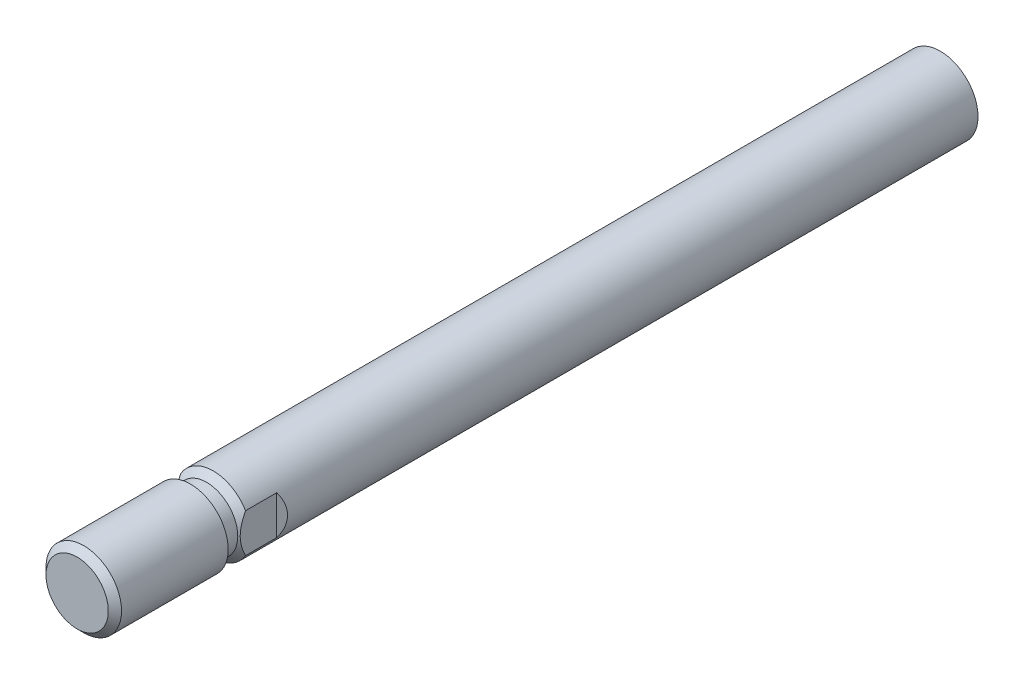
ISO-10303-21;
HEADER;
FILE_DESCRIPTION(('STEP AP214'),'2;1');
FILE_NAME('part.step','',(''),(''),'','','');
FILE_SCHEMA(('AUTOMOTIVE_DESIGN { 1 0 10303 214 1 1 1 1 }'));
ENDSEC;
DATA;
#1=APPLICATION_CONTEXT('core data for automotive mechanical design processes');
#2=APPLICATION_PROTOCOL_DEFINITION('international standard','automotive_design',2000,#1);
#3=PRODUCT_CONTEXT('',#1,'mechanical');
#4=PRODUCT('Part','Part','',(#3));
#5=PRODUCT_RELATED_PRODUCT_CATEGORY('part','',(#4));
#6=PRODUCT_DEFINITION_FORMATION('','',#4);
#7=PRODUCT_DEFINITION_CONTEXT('part definition',#1,'design');
#8=PRODUCT_DEFINITION('design','',#6,#7);
#9=PRODUCT_DEFINITION_SHAPE('','',#8);
#10=(LENGTH_UNIT() NAMED_UNIT(*) SI_UNIT(.MILLI.,.METRE.));
#11=(NAMED_UNIT(*) PLANE_ANGLE_UNIT() SI_UNIT($,.RADIAN.));
#12=(NAMED_UNIT(*) SI_UNIT($,.STERADIAN.) SOLID_ANGLE_UNIT());
#13=UNCERTAINTY_MEASURE_WITH_UNIT(LENGTH_MEASURE(1.E-05),#10,'distance_accuracy_value','');
#14=(GEOMETRIC_REPRESENTATION_CONTEXT(3) GLOBAL_UNCERTAINTY_ASSIGNED_CONTEXT((#13)) GLOBAL_UNIT_ASSIGNED_CONTEXT((#10,
#11,#12)) REPRESENTATION_CONTEXT('',''));
#15=CARTESIAN_POINT('',(0.,0.,0.));
#16=DIRECTION('',(0.,0.,1.));
#17=DIRECTION('',(1.,0.,0.));
#18=AXIS2_PLACEMENT_3D('',#15,#16,#17);
#19=CARTESIAN_POINT('',(-6.,3.60555127546399,2.99999999999909));
#20=CARTESIAN_POINT('',(-7.,3.60555127546399,1.99999999999999));
#21=CARTESIAN_POINT('',(-7.01,3.60555127546399,1.99));
#22=CARTESIAN_POINT('',(-7.04742844491216,3.60555127546399,1.95257155508788));
#23=B_SPLINE_CURVE_WITH_KNOTS('',1,(#19,#20,#21,#22),.UNSPECIFIED.,.F.,.F.,(2,1,1,2),(0.,1.,
1.01,1.04742844491216),.UNSPECIFIED.);
#24=DIRECTION('',(0.,-1.,0.));
#25=VECTOR('',#24,1.);
#26=SURFACE_OF_LINEAR_EXTRUSION('',#23,#25);
#27=CARTESIAN_POINT('',(-6.,-3.60555127546399,2.99999999999909));
#28=CARTESIAN_POINT('',(-6.05460305009511,-3.5146872681726,2.94539694990403));
#29=CARTESIAN_POINT('',(-6.10757727467276,-3.42185611468313,2.89242272532643));
#30=CARTESIAN_POINT('',(-6.20995893059434,-3.23233818919024,2.79004106940494));
#31=CARTESIAN_POINT('',(-6.25936623712517,-3.13565128245044,2.74063376287415));
#32=CARTESIAN_POINT('',(-6.3715105468397,-2.90276915492651,2.62848945315972));
#33=CARTESIAN_POINT('',(-6.43258592312827,-2.76495908411827,2.56741407687121));
#34=CARTESIAN_POINT('',(-6.54672958419891,-2.48264694016197,2.45327041580067));
#35=CARTESIAN_POINT('',(-6.59978928841199,-2.33813790912282,2.40021071158764));
#36=CARTESIAN_POINT('',(-6.69392147324922,-2.05245990341542,2.30607852675049));
#37=CARTESIAN_POINT('',(-6.73553694117638,-1.91164956276678,2.26446305882338));
#38=CARTESIAN_POINT('',(-6.81025329105877,-1.62551978340571,2.18974670894105));
#39=CARTESIAN_POINT('',(-6.84335189266993,-1.48019914873369,2.15664810732992));
#40=CARTESIAN_POINT('',(-6.90043231877212,-1.18595830748508,2.09956768122778));
#41=CARTESIAN_POINT('',(-6.92441131711201,-1.03703700024732,2.07558868288792));
#42=CARTESIAN_POINT('',(-6.96276594802224,-0.736746416045404,2.03723405197771));
#43=CARTESIAN_POINT('',(-6.97714263694242,-0.585377410229584,2.02285736305755));
#44=CARTESIAN_POINT('',(-6.99572154368489,-0.28587830644124,2.0042784563151));
#45=CARTESIAN_POINT('',(-7.00021035163798,-0.13778375353011,1.99978964836201));
#46=CARTESIAN_POINT('',(-6.99977449836706,0.158379860346094,2.00022550163293));
#47=CARTESIAN_POINT('',(-6.99484978126693,0.306448921154636,2.00515021873306));
#48=CARTESIAN_POINT('',(-6.975687614797,0.601342282417001,2.02431238520297));
#49=CARTESIAN_POINT('',(-6.96145196395231,0.748166817719649,2.03854803604764));
#50=CARTESIAN_POINT('',(-6.92394773734483,1.03947831910818,2.07605226265509));
#51=CARTESIAN_POINT('',(-6.9006794379425,1.18396535657063,2.0993205620574));
#52=CARTESIAN_POINT('',(-6.84694084650818,1.46235102562406,2.15305915349167));
#53=CARTESIAN_POINT('',(-6.81689596661697,1.59641489106689,2.18310403338285));
#54=CARTESIAN_POINT('',(-6.74950326023188,1.86086901707836,2.25049673976788));
#55=CARTESIAN_POINT('',(-6.71215258210059,1.99125782036754,2.28784741789914));
#56=CARTESIAN_POINT('',(-6.63067311834595,2.24772818276417,2.36932688165371));
#57=CARTESIAN_POINT('',(-6.58654375451224,2.37380937331705,2.41345624548738));
#58=CARTESIAN_POINT('',(-6.4920526650485,2.6212197252559,2.50794733495103));
#59=CARTESIAN_POINT('',(-6.44169006144759,2.74254821403355,2.5583099385519));
#60=CARTESIAN_POINT('',(-6.33000802367995,2.99189983642159,2.66999197631944));
#61=CARTESIAN_POINT('',(-6.268097211647,3.11939203472726,2.73190278835233));
#62=CARTESIAN_POINT('',(-6.13834506086701,3.36753252598152,2.86165493913221));
#63=CARTESIAN_POINT('',(-6.07052450866687,3.48820252690629,2.92947549133228));
#64=CARTESIAN_POINT('',(-6.,3.60555127546399,2.99999999999909));
#65=B_SPLINE_CURVE_WITH_KNOTS('',3,(#27,#28,#29,#30,#31,#32,#33,#34,#35,#36,#37,#38,#39,#40,#41,
#42,#43,#44,#45,#46,#47,#48,#49,#50,#51,#52,#53,#54,#55,#56,#57,#58,#59,#60,#61,#62,#63,#64),
.UNSPECIFIED.,.F.,.F.,(4,2,2,2,2,2,2,2,2,2,2,2,2,2,2,2,2,2,4),(0.,0.357700752589725,
0.715414015733441,1.20281762818256,1.69073935171607,2.14807007841627,2.60552312579027,
3.06311782187332,3.52066216967974,3.96476024014663,4.40886094666717,4.85287589482044,
5.29687725908359,5.71834638720044,6.13998035482457,6.56165030710014,6.98337972061568,
7.44697123336742,7.90899331902848),.UNSPECIFIED.);
#66=CARTESIAN_POINT('',(-6.,-3.60555127546399,2.99999999999909));
#67=VERTEX_POINT('',#66);
#68=CARTESIAN_POINT('',(-6.,3.60555127546399,2.99999999999909));
#69=VERTEX_POINT('',#68);
#70=EDGE_CURVE('E21',#67,#69,#65,.T.);
#71=ORIENTED_EDGE('',*,*,#70,.F.);
#72=DIRECTION('',(0.,-1.,0.));
#73=VECTOR('',#72,1.);
#74=CARTESIAN_POINT('',(-6.,3.60555127546399,2.99999999999909));
#75=LINE('',#74,#73);
#76=EDGE_CURVE('E62',#69,#67,#75,.T.);
#77=ORIENTED_EDGE('',*,*,#76,.F.);
#78=EDGE_LOOP('',(#71,#77));
#79=FACE_BOUND('',#78,.T.);
#80=ADVANCED_FACE('F16',(#79),#26,.T.);
#81=CARTESIAN_POINT('',(7.04742844491215,3.60555127546399,1.95257155508788));
#82=CARTESIAN_POINT('',(7.01,3.60555127546399,1.99));
#83=CARTESIAN_POINT('',(7.,3.60555127546399,1.99999999999999));
#84=CARTESIAN_POINT('',(6.,3.60555127546399,2.99999999999909));
#85=B_SPLINE_CURVE_WITH_KNOTS('',1,(#81,#82,#83,#84),.UNSPECIFIED.,.F.,.F.,(2,1,1,2),
(-0.0474284449121554,-0.01,0.,1.),.UNSPECIFIED.);
#86=DIRECTION('',(0.,-1.,0.));
#87=VECTOR('',#86,1.);
#88=SURFACE_OF_LINEAR_EXTRUSION('',#85,#87);
#89=CARTESIAN_POINT('',(6.,3.60555127546399,2.99999999999909));
#90=CARTESIAN_POINT('',(6.05460305009511,3.5146872681726,2.94539694990403));
#91=CARTESIAN_POINT('',(6.10757727467276,3.42185611468313,2.89242272532643));
#92=CARTESIAN_POINT('',(6.20995893059434,3.23233818919024,2.79004106940494));
#93=CARTESIAN_POINT('',(6.25936623712517,3.13565128245044,2.74063376287415));
#94=CARTESIAN_POINT('',(6.3715105468397,2.90276915492651,2.62848945315972));
#95=CARTESIAN_POINT('',(6.43258592312827,2.76495908411827,2.56741407687121));
#96=CARTESIAN_POINT('',(6.54672958419891,2.48264694016197,2.45327041580067));
#97=CARTESIAN_POINT('',(6.599789288412,2.33813790912282,2.40021071158763));
#98=CARTESIAN_POINT('',(6.69392147324923,2.05245990341542,2.30607852675049));
#99=CARTESIAN_POINT('',(6.73553694117638,1.91164956276678,2.26446305882338));
#100=CARTESIAN_POINT('',(6.81025329105877,1.62551978340571,2.18974670894105));
#101=CARTESIAN_POINT('',(6.84335189266993,1.48019914873369,2.15664810732992));
#102=CARTESIAN_POINT('',(6.90043231877212,1.18595830748507,2.09956768122778));
#103=CARTESIAN_POINT('',(6.92441131711201,1.03703700024732,2.07558868288792));
#104=CARTESIAN_POINT('',(6.96276594802224,0.7367464160454,2.03723405197771));
#105=CARTESIAN_POINT('',(6.97714263694242,0.58537741022958,2.02285736305755));
#106=CARTESIAN_POINT('',(6.99572154368489,0.285878306441236,2.0042784563151));
#107=CARTESIAN_POINT('',(7.00021035163798,0.137783753530106,1.99978964836201));
#108=CARTESIAN_POINT('',(6.99977449836706,-0.158379860346098,2.00022550163293));
#109=CARTESIAN_POINT('',(6.99484978126693,-0.30644892115464,2.00515021873306));
#110=CARTESIAN_POINT('',(6.975687614797,-0.601342282417005,2.02431238520297));
#111=CARTESIAN_POINT('',(6.96145196395231,-0.748166817719653,2.03854803604764));
#112=CARTESIAN_POINT('',(6.92394773734483,-1.03947831910818,2.07605226265509));
#113=CARTESIAN_POINT('',(6.9006794379425,-1.18396535657063,2.0993205620574));
#114=CARTESIAN_POINT('',(6.84694084650818,-1.46235102562406,2.15305915349167));
#115=CARTESIAN_POINT('',(6.81689596661697,-1.5964148910669,2.18310403338285));
#116=CARTESIAN_POINT('',(6.74950326023188,-1.86086901707836,2.25049673976789));
#117=CARTESIAN_POINT('',(6.71215258210059,-1.99125782036755,2.28784741789914));
#118=CARTESIAN_POINT('',(6.63067311834595,-2.24772818276417,2.36932688165371));
#119=CARTESIAN_POINT('',(6.58654375451224,-2.37380937331705,2.41345624548738));
#120=CARTESIAN_POINT('',(6.4920526650485,-2.6212197252559,2.50794733495103));
#121=CARTESIAN_POINT('',(6.44169006144758,-2.74254821403356,2.5583099385519));
#122=CARTESIAN_POINT('',(6.33000802367994,-2.99189983642159,2.66999197631944));
#123=CARTESIAN_POINT('',(6.268097211647,-3.11939203472726,2.73190278835233));
#124=CARTESIAN_POINT('',(6.13834506086701,-3.36753252598152,2.86165493913221));
#125=CARTESIAN_POINT('',(6.07052450866687,-3.48820252690629,2.92947549133228));
#126=CARTESIAN_POINT('',(6.,-3.60555127546399,2.99999999999909));
#127=B_SPLINE_CURVE_WITH_KNOTS('',3,(#89,#90,#91,#92,#93,#94,#95,#96,#97,#98,#99,#100,#101,#102,
#103,#104,#105,#106,#107,#108,#109,#110,#111,#112,#113,#114,#115,#116,#117,#118,#119,#120,#121,
#122,#123,#124,#125,#126),.UNSPECIFIED.,.F.,.F.,(4,2,2,2,2,2,2,2,2,2,2,2,2,2,2,2,2,2,4),(0.,
0.357700752589725,0.715414015733441,1.20281762818256,1.69073935171607,2.14807007841627,
2.60552312579027,3.06311782187332,3.52066216967974,3.96476024014664,4.40886094666717,
4.85287589482045,5.29687725908359,5.71834638720044,6.13998035482457,6.56165030710015,
6.98337972061568,7.44697123336742,7.90899331902848),.UNSPECIFIED.);
#128=CARTESIAN_POINT('',(6.,3.60555127546399,2.99999999999909));
#129=VERTEX_POINT('',#128);
#130=CARTESIAN_POINT('',(6.,-3.60555127546399,2.99999999999909));
#131=VERTEX_POINT('',#130);
#132=EDGE_CURVE('E99',#129,#131,#127,.T.);
#133=ORIENTED_EDGE('',*,*,#132,.F.);
#134=DIRECTION('',(0.,-1.,0.));
#135=VECTOR('',#134,1.);
#136=CARTESIAN_POINT('',(6.,3.60555127546399,2.99999999999909));
#137=LINE('',#136,#135);
#138=EDGE_CURVE('E76',#131,#129,#137,.F.);
#139=ORIENTED_EDGE('',*,*,#138,.F.);
#140=EDGE_LOOP('',(#133,#139));
#141=FACE_BOUND('',#140,.T.);
#142=ADVANCED_FACE('F92',(#141),#88,.T.);
#143=CARTESIAN_POINT('',(7.08400210827179,7.,-126.));
#144=DIRECTION('',(0.,0.,-1.));
#145=DIRECTION('',(0.,-1.,0.));
#146=AXIS2_PLACEMENT_3D('',#143,#144,#145);
#147=PLANE('',#146);
#148=CARTESIAN_POINT('',(0.,0.,-126.));
#149=DIRECTION('',(0.,0.,1.));
#150=DIRECTION('',(1.,0.,0.));
#151=AXIS2_PLACEMENT_3D('',#148,#149,#150);
#152=CIRCLE('',#151,7.);
#153=CARTESIAN_POINT('',(7.,0.,-126.));
#154=VERTEX_POINT('',#153);
#155=EDGE_CURVE('E106',#154,#154,#152,.T.);
#156=ORIENTED_EDGE('',*,*,#155,.F.);
#157=EDGE_LOOP('',(#156));
#158=FACE_BOUND('',#157,.T.);
#159=ADVANCED_FACE('F96',(#158),#147,.T.);
#160=CARTESIAN_POINT('',(-6.,3.60555127546399,9.81568678505333));
#161=DIRECTION('',(-1.,0.,0.));
#162=DIRECTION('',(0.,0.,-1.));
#163=AXIS2_PLACEMENT_3D('',#160,#161,#162);
#164=PLANE('',#163);
#165=DIRECTION('',(0.,0.,1.));
#166=VECTOR('',#165,1.);
#167=CARTESIAN_POINT('',(-6.,3.60555127546399,-58.6125000000002));
#168=LINE('',#167,#166);
#169=CARTESIAN_POINT('',(-6.,3.60555127546399,8.77499999999963));
#170=VERTEX_POINT('',#169);
#171=EDGE_CURVE('E71',#69,#170,#168,.T.);
#172=ORIENTED_EDGE('',*,*,#171,.F.);
#173=ORIENTED_EDGE('',*,*,#76,.T.);
#174=DIRECTION('',(0.,0.,-1.));
#175=VECTOR('',#174,1.);
#176=CARTESIAN_POINT('',(-6.,-3.60555127546399,-58.6125000000002));
#177=LINE('',#176,#175);
#178=CARTESIAN_POINT('',(-6.,-3.60555127546399,8.77499999999963));
#179=VERTEX_POINT('',#178);
#180=EDGE_CURVE('E67',#179,#67,#177,.T.);
#181=ORIENTED_EDGE('',*,*,#180,.F.);
#182=CARTESIAN_POINT('',(-6.,3.60555127546399,8.77499999999963));
#183=CARTESIAN_POINT('',(-6.,3.48201104346615,8.83862239786504));
#184=CARTESIAN_POINT('',(-6.,3.35749993655022,8.90036427200932));
#185=CARTESIAN_POINT('',(-6.,3.10632304907584,9.01948504833319));
#186=CARTESIAN_POINT('',(-6.,2.97965605501221,9.07686138668632));
#187=CARTESIAN_POINT('',(-6.,2.59475646017048,9.24210047370028));
#188=CARTESIAN_POINT('',(-6.,2.33313341734892,9.34227873732438));
#189=CARTESIAN_POINT('',(-6.,1.80546524183703,9.5141020095465));
#190=CARTESIAN_POINT('',(-6.,1.53957776052393,9.5862159335455));
#191=CARTESIAN_POINT('',(-6.,1.13605114138792,9.66981452679856));
#192=CARTESIAN_POINT('',(-6.,1.00091410649594,9.6935723962986));
#193=CARTESIAN_POINT('',(-6.,0.729400838655439,9.73231980950553));
#194=CARTESIAN_POINT('',(-6.,0.593024829173447,9.74731090374552));
#195=CARTESIAN_POINT('',(-6.,0.268006191759023,9.7719462768617));
#196=CARTESIAN_POINT('',(-6.,0.0790314317659819,9.77744763000093));
#197=CARTESIAN_POINT('',(-6.,-0.298641760240677,9.77054301012129));
#198=CARTESIAN_POINT('',(-6.,-0.487340062761024,9.75813035127963));
#199=CARTESIAN_POINT('',(-6.,-0.863028371967995,9.71612972100798));
#200=CARTESIAN_POINT('',(-6.,-1.05001589165097,9.68651985421345));
#201=CARTESIAN_POINT('',(-6.,-1.42079535812804,9.61174931969449));
#202=CARTESIAN_POINT('',(-6.,-1.60458753410159,9.56658977211285));
#203=CARTESIAN_POINT('',(-6.,-1.94430848384793,9.46965205812106));
#204=CARTESIAN_POINT('',(-6.,-2.10071783887129,9.41952990836874));
#205=CARTESIAN_POINT('',(-6.,-2.41046433743247,9.31053387391776));
#206=CARTESIAN_POINT('',(-6.,-2.56380102343282,9.25165869667343));
#207=CARTESIAN_POINT('',(-6.,-2.86695154346406,9.12666436159761));
#208=CARTESIAN_POINT('',(-6.,-3.01677419230815,9.06056638504725));
#209=CARTESIAN_POINT('',(-6.,-3.31337241765026,8.9221658014024));
#210=CARTESIAN_POINT('',(-6.,-3.46015057726084,8.8498687458078));
#211=CARTESIAN_POINT('',(-6.,-3.60555127546399,8.77499999999963));
#212=B_SPLINE_CURVE_WITH_KNOTS('',3,(#182,#183,#184,#185,#186,#187,#188,#189,#190,#191,#192,
#193,#194,#195,#196,#197,#198,#199,#200,#201,#202,#203,#204,#205,#206,#207,#208,#209,#210,#211),
.UNSPECIFIED.,.F.,.F.,(4,2,2,2,2,2,2,2,2,2,2,2,2,2,4),(0.,0.416857361966626,0.833957679252455,
1.67325944186285,2.49786460228488,2.90924413185805,3.32055088089062,3.88683397332512,
4.45332846718311,5.02054580390704,5.58772228889009,6.0801692481913,6.57268899871421,
7.06380131734536,7.55447833096308),.UNSPECIFIED.);
#213=EDGE_CURVE('E74',#170,#179,#212,.T.);
#214=ORIENTED_EDGE('',*,*,#213,.F.);
#215=EDGE_LOOP('',(#172,#173,#181,#214));
#216=FACE_BOUND('',#215,.T.);
#217=ADVANCED_FACE('F72',(#216),#164,.T.);
#218=CARTESIAN_POINT('',(6.,3.60555127546399,2.99999999999909));
#219=DIRECTION('',(1.,0.,0.));
#220=DIRECTION('',(0.,0.,1.));
#221=AXIS2_PLACEMENT_3D('',#218,#219,#220);
#222=PLANE('',#221);
#223=DIRECTION('',(0.,0.,-1.));
#224=VECTOR('',#223,1.);
#225=CARTESIAN_POINT('',(6.,3.60555127546399,-58.6125000000002));
#226=LINE('',#225,#224);
#227=CARTESIAN_POINT('',(6.,3.60555127546399,8.77499999999963));
#228=VERTEX_POINT('',#227);
#229=EDGE_CURVE('E41',#228,#129,#226,.T.);
#230=ORIENTED_EDGE('',*,*,#229,.F.);
#231=CARTESIAN_POINT('',(6.,-3.60555127546399,8.77499999999963));
#232=CARTESIAN_POINT('',(6.,-3.48201104346615,8.83862239786504));
#233=CARTESIAN_POINT('',(6.,-3.35749993655022,8.90036427200932));
#234=CARTESIAN_POINT('',(6.,-3.10632304907584,9.01948504833319));
#235=CARTESIAN_POINT('',(6.,-2.97965605501221,9.07686138668632));
#236=CARTESIAN_POINT('',(6.,-2.59475646017048,9.24210047370028));
#237=CARTESIAN_POINT('',(6.,-2.33313341734892,9.34227873732438));
#238=CARTESIAN_POINT('',(6.,-1.80546524183703,9.5141020095465));
#239=CARTESIAN_POINT('',(6.,-1.53957776052393,9.5862159335455));
#240=CARTESIAN_POINT('',(6.,-1.13605114138792,9.66981452679856));
#241=CARTESIAN_POINT('',(6.,-1.00091410649594,9.6935723962986));
#242=CARTESIAN_POINT('',(6.,-0.729400838655438,9.73231980950553));
#243=CARTESIAN_POINT('',(6.,-0.593024829173446,9.74731090374552));
#244=CARTESIAN_POINT('',(6.,-0.268006191759022,9.7719462768617));
#245=CARTESIAN_POINT('',(6.,-0.0790314317659805,9.77744763000093));
#246=CARTESIAN_POINT('',(6.,0.298641760240678,9.77054301012129));
#247=CARTESIAN_POINT('',(6.,0.487340062761025,9.75813035127963));
#248=CARTESIAN_POINT('',(6.,0.863028371967996,9.71612972100798));
#249=CARTESIAN_POINT('',(6.,1.05001589165097,9.68651985421345));
#250=CARTESIAN_POINT('',(6.,1.42079535812804,9.61174931969449));
#251=CARTESIAN_POINT('',(6.,1.60458753410159,9.56658977211285));
#252=CARTESIAN_POINT('',(6.,1.94430848384794,9.46965205812106));
#253=CARTESIAN_POINT('',(6.,2.10071783887129,9.41952990836874));
#254=CARTESIAN_POINT('',(6.,2.41046433743247,9.31053387391776));
#255=CARTESIAN_POINT('',(6.,2.56380102343282,9.25165869667343));
#256=CARTESIAN_POINT('',(6.,2.86695154346406,9.12666436159761));
#257=CARTESIAN_POINT('',(6.,3.01677419230814,9.06056638504725));
#258=CARTESIAN_POINT('',(6.,3.31337241765026,8.9221658014024));
#259=CARTESIAN_POINT('',(6.,3.46015057726084,8.8498687458078));
#260=CARTESIAN_POINT('',(6.,3.60555127546399,8.77499999999963));
#261=B_SPLINE_CURVE_WITH_KNOTS('',3,(#231,#232,#233,#234,#235,#236,#237,#238,#239,#240,#241,
#242,#243,#244,#245,#246,#247,#248,#249,#250,#251,#252,#253,#254,#255,#256,#257,#258,#259,#260),
.UNSPECIFIED.,.F.,.F.,(4,2,2,2,2,2,2,2,2,2,2,2,2,2,4),(0.,0.416857361966626,0.833957679252455,
1.67325944186285,2.49786460228488,2.90924413185805,3.32055088089062,3.88683397332512,
4.45332846718311,5.02054580390704,5.58772228889009,6.08016924819131,6.57268899871421,
7.06380131734536,7.55447833096307),.UNSPECIFIED.);
#262=CARTESIAN_POINT('',(6.,-3.60555127546399,8.77499999999963));
#263=VERTEX_POINT('',#262);
#264=EDGE_CURVE('E121',#263,#228,#261,.T.);
#265=ORIENTED_EDGE('',*,*,#264,.F.);
#266=DIRECTION('',(0.,0.,1.));
#267=VECTOR('',#266,1.);
#268=CARTESIAN_POINT('',(6.,-3.60555127546399,-58.6125000000002));
#269=LINE('',#268,#267);
#270=EDGE_CURVE('E82',#131,#263,#269,.T.);
#271=ORIENTED_EDGE('',*,*,#270,.F.);
#272=ORIENTED_EDGE('',*,*,#138,.T.);
#273=EDGE_LOOP('',(#230,#265,#271,#272));
#274=FACE_BOUND('',#273,.T.);
#275=ADVANCED_FACE('F113',(#274),#222,.T.);
#276=CARTESIAN_POINT('',(0.,0.,8.77499999999964));
#277=DIRECTION('',(0.,0.,1.));
#278=DIRECTION('',(1.,0.,0.));
#279=AXIS2_PLACEMENT_3D('',#276,#277,#278);
#280=CYLINDRICAL_SURFACE('',#279,7.);
#281=ORIENTED_EDGE('',*,*,#171,.T.);
#282=CARTESIAN_POINT('',(0.,0.,8.77499999999963));
#283=DIRECTION('',(0.,0.,1.));
#284=DIRECTION('',(0.,1.,0.));
#285=AXIS2_PLACEMENT_3D('',#282,#283,#284);
#286=CIRCLE('',#285,7.);
#287=EDGE_CURVE('E128',#228,#170,#286,.T.);
#288=ORIENTED_EDGE('',*,*,#287,.F.);
#289=ORIENTED_EDGE('',*,*,#229,.T.);
#290=ORIENTED_EDGE('',*,*,#132,.T.);
#291=ORIENTED_EDGE('',*,*,#270,.T.);
#292=CARTESIAN_POINT('',(0.,0.,8.77499999999963));
#293=DIRECTION('',(0.,0.,1.));
#294=DIRECTION('',(0.,1.,0.));
#295=AXIS2_PLACEMENT_3D('',#292,#293,#294);
#296=CIRCLE('',#295,7.);
#297=EDGE_CURVE('E129',#179,#263,#296,.T.);
#298=ORIENTED_EDGE('',*,*,#297,.F.);
#299=ORIENTED_EDGE('',*,*,#180,.T.);
#300=ORIENTED_EDGE('',*,*,#70,.T.);
#301=EDGE_LOOP('',(#281,#288,#289,#290,#291,#298,#299,#300));
#302=FACE_BOUND('',#301,.T.);
#303=ORIENTED_EDGE('',*,*,#155,.T.);
#304=EDGE_LOOP('',(#303));
#305=FACE_BOUND('',#304,.T.);
#306=ADVANCED_FACE('F78',(#302,#305),#280,.T.);
#307=CARTESIAN_POINT('',(0.,0.,10.));
#308=DIRECTION('',(0.,0.,-1.));
#309=DIRECTION('',(-1.,0.,0.));
#310=AXIS2_PLACEMENT_3D('',#307,#308,#309);
#311=CONICAL_SURFACE('',#310,5.775,0.7853981633973);
#312=CARTESIAN_POINT('',(0.,0.,10.));
#313=DIRECTION('',(0.,0.,1.));
#314=DIRECTION('',(0.,1.,0.));
#315=AXIS2_PLACEMENT_3D('',#312,#313,#314);
#316=CIRCLE('',#315,5.775);
#317=CARTESIAN_POINT('',(0.,5.775,10.));
#318=VERTEX_POINT('',#317);
#319=EDGE_CURVE('E181',#318,#318,#316,.T.);
#320=ORIENTED_EDGE('',*,*,#319,.F.);
#321=EDGE_LOOP('',(#320));
#322=FACE_BOUND('',#321,.T.);
#323=ORIENTED_EDGE('',*,*,#264,.T.);
#324=ORIENTED_EDGE('',*,*,#287,.T.);
#325=ORIENTED_EDGE('',*,*,#213,.T.);
#326=ORIENTED_EDGE('',*,*,#297,.T.);
#327=EDGE_LOOP('',(#323,#324,#325,#326));
#328=FACE_BOUND('',#327,.T.);
#329=ADVANCED_FACE('F112',(#322,#328),#311,.T.);
#330=CARTESIAN_POINT('',(0.,0.,13.));
#331=DIRECTION('',(0.,0.,1.));
#332=DIRECTION('',(1.,0.,0.));
#333=AXIS2_PLACEMENT_3D('',#330,#331,#332);
#334=CYLINDRICAL_SURFACE('',#333,5.775);
#335=CARTESIAN_POINT('',(0.,0.,13.));
#336=DIRECTION('',(0.,0.,1.));
#337=DIRECTION('',(1.,0.,0.));
#338=AXIS2_PLACEMENT_3D('',#335,#336,#337);
#339=CIRCLE('',#338,5.775);
#340=CARTESIAN_POINT('',(5.775,0.,13.));
#341=VERTEX_POINT('',#340);
#342=EDGE_CURVE('E130',#341,#341,#339,.T.);
#343=ORIENTED_EDGE('',*,*,#342,.F.);
#344=EDGE_LOOP('',(#343));
#345=FACE_BOUND('',#344,.T.);
#346=ORIENTED_EDGE('',*,*,#319,.T.);
#347=EDGE_LOOP('',(#346));
#348=FACE_BOUND('',#347,.T.);
#349=ADVANCED_FACE('F144',(#345,#348),#334,.T.);
#350=CARTESIAN_POINT('',(7.08400210827179,7.,13.));
#351=DIRECTION('',(0.,0.,-1.));
#352=DIRECTION('',(0.,-1.,0.));
#353=AXIS2_PLACEMENT_3D('',#350,#351,#352);
#354=PLANE('',#353);
#355=ORIENTED_EDGE('',*,*,#342,.T.);
#356=EDGE_LOOP('',(#355));
#357=FACE_BOUND('',#356,.T.);
#358=CARTESIAN_POINT('',(0.,0.,13.));
#359=DIRECTION('',(0.,0.,1.));
#360=DIRECTION('',(1.,0.,0.));
#361=AXIS2_PLACEMENT_3D('',#358,#359,#360);
#362=CIRCLE('',#361,7.);
#363=CARTESIAN_POINT('',(7.,0.,13.));
#364=VERTEX_POINT('',#363);
#365=EDGE_CURVE('E178',#364,#364,#362,.T.);
#366=ORIENTED_EDGE('',*,*,#365,.F.);
#367=EDGE_LOOP('',(#366));
#368=FACE_BOUND('',#367,.T.);
#369=ADVANCED_FACE('F150',(#357,#368),#354,.T.);
#370=CARTESIAN_POINT('',(0.,0.,32.7750000000006));
#371=DIRECTION('',(0.,0.,1.));
#372=DIRECTION('',(1.,0.,0.));
#373=AXIS2_PLACEMENT_3D('',#370,#371,#372);
#374=CYLINDRICAL_SURFACE('',#373,7.);
#375=ORIENTED_EDGE('',*,*,#365,.T.);
#376=EDGE_LOOP('',(#375));
#377=FACE_BOUND('',#376,.T.);
#378=CARTESIAN_POINT('',(0.,0.,32.7750000000006));
#379=DIRECTION('',(0.,0.,1.));
#380=DIRECTION('',(0.,1.,0.));
#381=AXIS2_PLACEMENT_3D('',#378,#379,#380);
#382=CIRCLE('',#381,7.);
#383=CARTESIAN_POINT('',(0.,7.,32.7750000000006));
#384=VERTEX_POINT('',#383);
#385=EDGE_CURVE('E32',#384,#384,#382,.T.);
#386=ORIENTED_EDGE('',*,*,#385,.F.);
#387=EDGE_LOOP('',(#386));
#388=FACE_BOUND('',#387,.T.);
#389=ADVANCED_FACE('F161',(#377,#388),#374,.T.);
#390=CARTESIAN_POINT('',(5.84430210823843,-5.775,34.));
#391=DIRECTION('',(0.,0.,1.));
#392=DIRECTION('',(0.,1.,0.));
#393=AXIS2_PLACEMENT_3D('',#390,#391,#392);
#394=PLANE('',#393);
#395=CARTESIAN_POINT('',(0.,0.,34.));
#396=DIRECTION('',(0.,0.,-1.));
#397=DIRECTION('',(-1.,0.,0.));
#398=AXIS2_PLACEMENT_3D('',#395,#396,#397);
#399=CIRCLE('',#398,5.775);
#400=CARTESIAN_POINT('',(-5.775,0.,34.));
#401=VERTEX_POINT('',#400);
#402=EDGE_CURVE('E11',#401,#401,#399,.T.);
#403=ORIENTED_EDGE('',*,*,#402,.F.);
#404=EDGE_LOOP('',(#403));
#405=FACE_BOUND('',#404,.T.);
#406=ADVANCED_FACE('F155',(#405),#394,.T.);
#407=CARTESIAN_POINT('',(0.,0.,34.));
#408=DIRECTION('',(0.,0.,-1.));
#409=DIRECTION('',(-1.,0.,0.));
#410=AXIS2_PLACEMENT_3D('',#407,#408,#409);
#411=CONICAL_SURFACE('',#410,5.775,0.78539816339767);
#412=ORIENTED_EDGE('',*,*,#402,.T.);
#413=EDGE_LOOP('',(#412));
#414=FACE_BOUND('',#413,.T.);
#415=ORIENTED_EDGE('',*,*,#385,.T.);
#416=EDGE_LOOP('',(#415));
#417=FACE_BOUND('',#416,.T.);
#418=ADVANCED_FACE('F153',(#414,#417),#411,.T.);
#419=CLOSED_SHELL('',(#80,#142,#159,#217,#275,#306,#329,#349,#369,#389,#406,#418));
#420=MANIFOLD_SOLID_BREP('B1',#419);
#421=ADVANCED_BREP_SHAPE_REPRESENTATION('',(#18,#420),#14);
#422=SHAPE_DEFINITION_REPRESENTATION(#9,#421);
ENDSEC;
END-ISO-10303-21;
